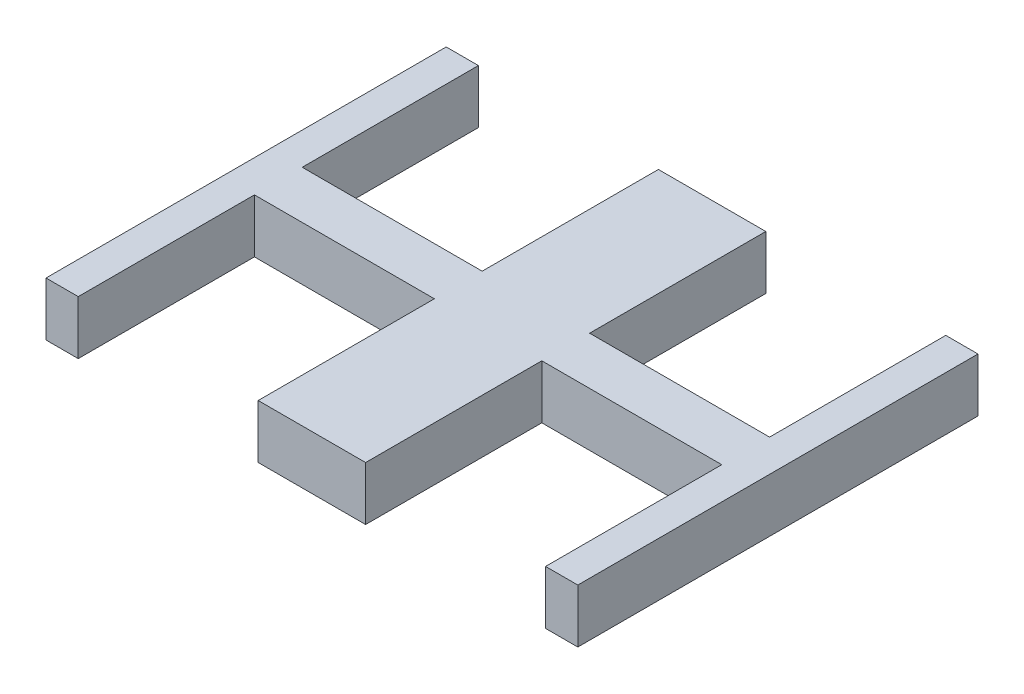
ISO-10303-21;
HEADER;
FILE_DESCRIPTION(('STEP AP214'),'2;1');
FILE_NAME('part.step','',(''),(''),'','','');
FILE_SCHEMA(('AUTOMOTIVE_DESIGN { 1 0 10303 214 1 1 1 1 }'));
ENDSEC;
DATA;
#1=APPLICATION_CONTEXT('core data for automotive mechanical design processes');
#2=APPLICATION_PROTOCOL_DEFINITION('international standard','automotive_design',2000,#1);
#3=PRODUCT_CONTEXT('',#1,'mechanical');
#4=PRODUCT('Part','Part','',(#3));
#5=PRODUCT_RELATED_PRODUCT_CATEGORY('part','',(#4));
#6=PRODUCT_DEFINITION_FORMATION('','',#4);
#7=PRODUCT_DEFINITION_CONTEXT('part definition',#1,'design');
#8=PRODUCT_DEFINITION('design','',#6,#7);
#9=PRODUCT_DEFINITION_SHAPE('','',#8);
#10=(LENGTH_UNIT() NAMED_UNIT(*) SI_UNIT(.MILLI.,.METRE.));
#11=(NAMED_UNIT(*) PLANE_ANGLE_UNIT() SI_UNIT($,.RADIAN.));
#12=(NAMED_UNIT(*) SI_UNIT($,.STERADIAN.) SOLID_ANGLE_UNIT());
#13=UNCERTAINTY_MEASURE_WITH_UNIT(LENGTH_MEASURE(1.E-05),#10,'distance_accuracy_value','');
#14=(GEOMETRIC_REPRESENTATION_CONTEXT(3) GLOBAL_UNCERTAINTY_ASSIGNED_CONTEXT((#13)) GLOBAL_UNIT_ASSIGNED_CONTEXT((#10,
#11,#12)) REPRESENTATION_CONTEXT('',''));
#15=CARTESIAN_POINT('',(0.,0.,0.));
#16=DIRECTION('',(0.,0.,1.));
#17=DIRECTION('',(1.,0.,0.));
#18=AXIS2_PLACEMENT_3D('',#15,#16,#17);
#19=CARTESIAN_POINT('',(-9.9,2.,-7.45));
#20=DIRECTION('',(0.,0.,1.));
#21=DIRECTION('',(1.,0.,0.));
#22=AXIS2_PLACEMENT_3D('',#19,#20,#21);
#23=PLANE('',#22);
#24=DIRECTION('',(-1.,0.,0.));
#25=VECTOR('',#24,1.);
#26=CARTESIAN_POINT('',(-9.9,0.,-7.45));
#27=LINE('',#26,#25);
#28=CARTESIAN_POINT('',(9.9,0.,-7.45));
#29=VERTEX_POINT('',#28);
#30=CARTESIAN_POINT('',(8.7,0.,-7.45));
#31=VERTEX_POINT('',#30);
#32=EDGE_CURVE('E261',#29,#31,#27,.T.);
#33=ORIENTED_EDGE('',*,*,#32,.T.);
#34=DIRECTION('',(0.,1.,0.));
#35=VECTOR('',#34,1.);
#36=CARTESIAN_POINT('',(8.7,0.,-7.45));
#37=LINE('',#36,#35);
#38=CARTESIAN_POINT('',(8.7,2.,-7.45));
#39=VERTEX_POINT('',#38);
#40=EDGE_CURVE('E527',#31,#39,#37,.T.);
#41=ORIENTED_EDGE('',*,*,#40,.T.);
#42=DIRECTION('',(-1.,0.,0.));
#43=VECTOR('',#42,1.);
#44=CARTESIAN_POINT('',(-9.9,2.,-7.45));
#45=LINE('',#44,#43);
#46=CARTESIAN_POINT('',(9.9,2.,-7.45));
#47=VERTEX_POINT('',#46);
#48=EDGE_CURVE('E221',#47,#39,#45,.T.);
#49=ORIENTED_EDGE('',*,*,#48,.F.);
#50=DIRECTION('',(0.,-1.,0.));
#51=VECTOR('',#50,1.);
#52=CARTESIAN_POINT('',(9.9,2.,-7.45));
#53=LINE('',#52,#51);
#54=EDGE_CURVE('E11',#47,#29,#53,.T.);
#55=ORIENTED_EDGE('',*,*,#54,.T.);
#56=EDGE_LOOP('',(#33,#41,#49,#55));
#57=FACE_BOUND('',#56,.T.);
#58=ADVANCED_FACE('F45',(#57),#23,.F.);
#59=CARTESIAN_POINT('',(-8.7,2.,-7.45));
#60=VERTEX_POINT('',#59);
#61=CARTESIAN_POINT('',(-9.9,2.,-7.45));
#62=VERTEX_POINT('',#61);
#63=EDGE_CURVE('E297',#60,#62,#45,.T.);
#64=ORIENTED_EDGE('',*,*,#63,.F.);
#65=DIRECTION('',(0.,1.,0.));
#66=VECTOR('',#65,1.);
#67=CARTESIAN_POINT('',(-8.7,0.,-7.45));
#68=LINE('',#67,#66);
#69=CARTESIAN_POINT('',(-8.7,0.,-7.45));
#70=VERTEX_POINT('',#69);
#71=EDGE_CURVE('E270',#70,#60,#68,.T.);
#72=ORIENTED_EDGE('',*,*,#71,.F.);
#73=CARTESIAN_POINT('',(-9.9,0.,-7.45));
#74=VERTEX_POINT('',#73);
#75=EDGE_CURVE('E256',#70,#74,#27,.T.);
#76=ORIENTED_EDGE('',*,*,#75,.T.);
#77=DIRECTION('',(0.,-1.,0.));
#78=VECTOR('',#77,1.);
#79=CARTESIAN_POINT('',(-9.9,2.,-7.45));
#80=LINE('',#79,#78);
#81=EDGE_CURVE('E54',#62,#74,#80,.T.);
#82=ORIENTED_EDGE('',*,*,#81,.F.);
#83=EDGE_LOOP('',(#64,#72,#76,#82));
#84=FACE_BOUND('',#83,.T.);
#85=ADVANCED_FACE('F305',(#84),#23,.F.);
#86=CARTESIAN_POINT('',(-9.9,2.,7.45));
#87=DIRECTION('',(0.,0.,-1.));
#88=DIRECTION('',(-1.,0.,0.));
#89=AXIS2_PLACEMENT_3D('',#86,#87,#88);
#90=PLANE('',#89);
#91=DIRECTION('',(1.,0.,0.));
#92=VECTOR('',#91,1.);
#93=CARTESIAN_POINT('',(-9.9,0.,7.45));
#94=LINE('',#93,#92);
#95=CARTESIAN_POINT('',(-9.9,0.,7.45));
#96=VERTEX_POINT('',#95);
#97=CARTESIAN_POINT('',(-8.7,0.,7.45));
#98=VERTEX_POINT('',#97);
#99=EDGE_CURVE('E238',#96,#98,#94,.T.);
#100=ORIENTED_EDGE('',*,*,#99,.T.);
#101=DIRECTION('',(0.,1.,0.));
#102=VECTOR('',#101,1.);
#103=CARTESIAN_POINT('',(-8.7,0.,7.45));
#104=LINE('',#103,#102);
#105=CARTESIAN_POINT('',(-8.7,2.,7.45));
#106=VERTEX_POINT('',#105);
#107=EDGE_CURVE('E340',#98,#106,#104,.T.);
#108=ORIENTED_EDGE('',*,*,#107,.T.);
#109=DIRECTION('',(1.,0.,0.));
#110=VECTOR('',#109,1.);
#111=CARTESIAN_POINT('',(-9.9,2.,7.45));
#112=LINE('',#111,#110);
#113=CARTESIAN_POINT('',(-9.9,2.,7.45));
#114=VERTEX_POINT('',#113);
#115=EDGE_CURVE('E217',#114,#106,#112,.T.);
#116=ORIENTED_EDGE('',*,*,#115,.F.);
#117=DIRECTION('',(0.,-1.,0.));
#118=VECTOR('',#117,1.);
#119=CARTESIAN_POINT('',(-9.9,2.,7.45));
#120=LINE('',#119,#118);
#121=EDGE_CURVE('E229',#114,#96,#120,.T.);
#122=ORIENTED_EDGE('',*,*,#121,.T.);
#123=EDGE_LOOP('',(#100,#108,#116,#122));
#124=FACE_BOUND('',#123,.T.);
#125=ADVANCED_FACE('F307',(#124),#90,.F.);
#126=CARTESIAN_POINT('',(8.7,2.,7.45));
#127=VERTEX_POINT('',#126);
#128=CARTESIAN_POINT('',(9.9,2.,7.45));
#129=VERTEX_POINT('',#128);
#130=EDGE_CURVE('E201',#127,#129,#112,.T.);
#131=ORIENTED_EDGE('',*,*,#130,.F.);
#132=DIRECTION('',(0.,1.,0.));
#133=VECTOR('',#132,1.);
#134=CARTESIAN_POINT('',(8.7,0.,7.45));
#135=LINE('',#134,#133);
#136=CARTESIAN_POINT('',(8.7,0.,7.45));
#137=VERTEX_POINT('',#136);
#138=EDGE_CURVE('E183',#137,#127,#135,.T.);
#139=ORIENTED_EDGE('',*,*,#138,.F.);
#140=CARTESIAN_POINT('',(9.9,0.,7.45));
#141=VERTEX_POINT('',#140);
#142=EDGE_CURVE('E260',#137,#141,#94,.T.);
#143=ORIENTED_EDGE('',*,*,#142,.T.);
#144=DIRECTION('',(0.,-1.,0.));
#145=VECTOR('',#144,1.);
#146=CARTESIAN_POINT('',(9.9,2.,7.45));
#147=LINE('',#146,#145);
#148=EDGE_CURVE('E211',#129,#141,#147,.T.);
#149=ORIENTED_EDGE('',*,*,#148,.F.);
#150=EDGE_LOOP('',(#131,#139,#143,#149));
#151=FACE_BOUND('',#150,.T.);
#152=ADVANCED_FACE('F209',(#151),#90,.F.);
#153=CARTESIAN_POINT('',(9.9,2.,-7.45));
#154=DIRECTION('',(-1.,0.,0.));
#155=DIRECTION('',(0.,0.,1.));
#156=AXIS2_PLACEMENT_3D('',#153,#154,#155);
#157=PLANE('',#156);
#158=DIRECTION('',(0.,0.,-1.));
#159=VECTOR('',#158,1.);
#160=CARTESIAN_POINT('',(9.9,0.,-7.45));
#161=LINE('',#160,#159);
#162=EDGE_CURVE('E268',#141,#29,#161,.T.);
#163=ORIENTED_EDGE('',*,*,#162,.T.);
#164=ORIENTED_EDGE('',*,*,#54,.F.);
#165=DIRECTION('',(0.,0.,-1.));
#166=VECTOR('',#165,1.);
#167=CARTESIAN_POINT('',(9.9,2.,-7.45));
#168=LINE('',#167,#166);
#169=EDGE_CURVE('E294',#129,#47,#168,.T.);
#170=ORIENTED_EDGE('',*,*,#169,.F.);
#171=ORIENTED_EDGE('',*,*,#148,.T.);
#172=EDGE_LOOP('',(#163,#164,#170,#171));
#173=FACE_BOUND('',#172,.T.);
#174=ADVANCED_FACE('F47',(#173),#157,.F.);
#175=CARTESIAN_POINT('',(2.,2.,-7.45));
#176=VERTEX_POINT('',#175);
#177=CARTESIAN_POINT('',(-2.,2.,-7.45));
#178=VERTEX_POINT('',#177);
#179=EDGE_CURVE('E300',#176,#178,#45,.T.);
#180=ORIENTED_EDGE('',*,*,#179,.F.);
#181=DIRECTION('',(0.,1.,0.));
#182=VECTOR('',#181,1.);
#183=CARTESIAN_POINT('',(2.,0.,-7.45));
#184=LINE('',#183,#182);
#185=CARTESIAN_POINT('',(2.,0.,-7.45));
#186=VERTEX_POINT('',#185);
#187=EDGE_CURVE('E329',#186,#176,#184,.T.);
#188=ORIENTED_EDGE('',*,*,#187,.F.);
#189=CARTESIAN_POINT('',(-2.,0.,-7.45));
#190=VERTEX_POINT('',#189);
#191=EDGE_CURVE('E266',#186,#190,#27,.T.);
#192=ORIENTED_EDGE('',*,*,#191,.T.);
#193=DIRECTION('',(0.,1.,0.));
#194=VECTOR('',#193,1.);
#195=CARTESIAN_POINT('',(-2.,0.,-7.45));
#196=LINE('',#195,#194);
#197=EDGE_CURVE('E274',#190,#178,#196,.T.);
#198=ORIENTED_EDGE('',*,*,#197,.T.);
#199=EDGE_LOOP('',(#180,#188,#192,#198));
#200=FACE_BOUND('',#199,.T.);
#201=ADVANCED_FACE('F308',(#200),#23,.F.);
#202=CARTESIAN_POINT('',(-9.9,2.,-7.45));
#203=DIRECTION('',(1.,0.,0.));
#204=DIRECTION('',(0.,0.,-1.));
#205=AXIS2_PLACEMENT_3D('',#202,#203,#204);
#206=PLANE('',#205);
#207=DIRECTION('',(0.,0.,1.));
#208=VECTOR('',#207,1.);
#209=CARTESIAN_POINT('',(-9.9,0.,-7.45));
#210=LINE('',#209,#208);
#211=EDGE_CURVE('E248',#74,#96,#210,.T.);
#212=ORIENTED_EDGE('',*,*,#211,.T.);
#213=ORIENTED_EDGE('',*,*,#121,.F.);
#214=DIRECTION('',(0.,0.,1.));
#215=VECTOR('',#214,1.);
#216=CARTESIAN_POINT('',(-9.9,2.,-7.45));
#217=LINE('',#216,#215);
#218=EDGE_CURVE('E215',#62,#114,#217,.T.);
#219=ORIENTED_EDGE('',*,*,#218,.F.);
#220=ORIENTED_EDGE('',*,*,#81,.T.);
#221=EDGE_LOOP('',(#212,#213,#219,#220));
#222=FACE_BOUND('',#221,.T.);
#223=ADVANCED_FACE('F246',(#222),#206,.F.);
#224=CARTESIAN_POINT('',(-2.,2.,7.45));
#225=VERTEX_POINT('',#224);
#226=CARTESIAN_POINT('',(2.,2.,7.45));
#227=VERTEX_POINT('',#226);
#228=EDGE_CURVE('E214',#225,#227,#112,.T.);
#229=ORIENTED_EDGE('',*,*,#228,.F.);
#230=DIRECTION('',(0.,1.,0.));
#231=VECTOR('',#230,1.);
#232=CARTESIAN_POINT('',(-2.,0.,7.45));
#233=LINE('',#232,#231);
#234=CARTESIAN_POINT('',(-2.,0.,7.45));
#235=VERTEX_POINT('',#234);
#236=EDGE_CURVE('E546',#235,#225,#233,.T.);
#237=ORIENTED_EDGE('',*,*,#236,.F.);
#238=CARTESIAN_POINT('',(2.,0.,7.45));
#239=VERTEX_POINT('',#238);
#240=EDGE_CURVE('E264',#235,#239,#94,.T.);
#241=ORIENTED_EDGE('',*,*,#240,.T.);
#242=DIRECTION('',(0.,1.,0.));
#243=VECTOR('',#242,1.);
#244=CARTESIAN_POINT('',(2.,0.,7.45));
#245=LINE('',#244,#243);
#246=EDGE_CURVE('E194',#239,#227,#245,.T.);
#247=ORIENTED_EDGE('',*,*,#246,.T.);
#248=EDGE_LOOP('',(#229,#237,#241,#247));
#249=FACE_BOUND('',#248,.T.);
#250=ADVANCED_FACE('F315',(#249),#90,.F.);
#251=CARTESIAN_POINT('',(0.,2.,0.));
#252=DIRECTION('',(0.,1.,0.));
#253=DIRECTION('',(0.,0.,1.));
#254=AXIS2_PLACEMENT_3D('',#251,#252,#253);
#255=PLANE('',#254);
#256=DIRECTION('',(0.,0.,-1.));
#257=VECTOR('',#256,1.);
#258=CARTESIAN_POINT('',(8.7,2.,-7.45));
#259=LINE('',#258,#257);
#260=CARTESIAN_POINT('',(8.7,2.,-0.889999999999999));
#261=VERTEX_POINT('',#260);
#262=EDGE_CURVE('E347',#261,#39,#259,.T.);
#263=ORIENTED_EDGE('',*,*,#262,.F.);
#264=DIRECTION('',(1.,0.,0.));
#265=VECTOR('',#264,1.);
#266=CARTESIAN_POINT('',(8.7,2.,-0.889999999999999));
#267=LINE('',#266,#265);
#268=CARTESIAN_POINT('',(2.,2.,-0.889999999999999));
#269=VERTEX_POINT('',#268);
#270=EDGE_CURVE('E337',#269,#261,#267,.T.);
#271=ORIENTED_EDGE('',*,*,#270,.F.);
#272=DIRECTION('',(0.,0.,1.));
#273=VECTOR('',#272,1.);
#274=CARTESIAN_POINT('',(2.,2.,-7.45));
#275=LINE('',#274,#273);
#276=EDGE_CURVE('E335',#176,#269,#275,.T.);
#277=ORIENTED_EDGE('',*,*,#276,.F.);
#278=ORIENTED_EDGE('',*,*,#179,.T.);
#279=DIRECTION('',(0.,0.,-1.));
#280=VECTOR('',#279,1.);
#281=CARTESIAN_POINT('',(-2.,2.,-7.45));
#282=LINE('',#281,#280);
#283=CARTESIAN_POINT('',(-2.,2.,-0.889999999999999));
#284=VERTEX_POINT('',#283);
#285=EDGE_CURVE('E285',#284,#178,#282,.T.);
#286=ORIENTED_EDGE('',*,*,#285,.F.);
#287=DIRECTION('',(1.,0.,0.));
#288=VECTOR('',#287,1.);
#289=CARTESIAN_POINT('',(-8.7,2.,-0.889999999999998));
#290=LINE('',#289,#288);
#291=CARTESIAN_POINT('',(-8.7,2.,-0.889999999999998));
#292=VERTEX_POINT('',#291);
#293=EDGE_CURVE('E372',#292,#284,#290,.T.);
#294=ORIENTED_EDGE('',*,*,#293,.F.);
#295=DIRECTION('',(0.,0.,1.));
#296=VECTOR('',#295,1.);
#297=CARTESIAN_POINT('',(-8.7,2.,-7.45));
#298=LINE('',#297,#296);
#299=EDGE_CURVE('E207',#60,#292,#298,.T.);
#300=ORIENTED_EDGE('',*,*,#299,.F.);
#301=ORIENTED_EDGE('',*,*,#63,.T.);
#302=ORIENTED_EDGE('',*,*,#218,.T.);
#303=ORIENTED_EDGE('',*,*,#115,.T.);
#304=DIRECTION('',(0.,0.,1.));
#305=VECTOR('',#304,1.);
#306=CARTESIAN_POINT('',(-8.7,2.,7.45));
#307=LINE('',#306,#305);
#308=CARTESIAN_POINT('',(-8.7,2.,0.890000000000002));
#309=VERTEX_POINT('',#308);
#310=EDGE_CURVE('E540',#309,#106,#307,.T.);
#311=ORIENTED_EDGE('',*,*,#310,.F.);
#312=DIRECTION('',(-1.,0.,0.));
#313=VECTOR('',#312,1.);
#314=CARTESIAN_POINT('',(-8.7,2.,0.890000000000002));
#315=LINE('',#314,#313);
#316=CARTESIAN_POINT('',(-2.,2.,0.890000000000002));
#317=VERTEX_POINT('',#316);
#318=EDGE_CURVE('E550',#317,#309,#315,.T.);
#319=ORIENTED_EDGE('',*,*,#318,.F.);
#320=DIRECTION('',(0.,0.,-1.));
#321=VECTOR('',#320,1.);
#322=CARTESIAN_POINT('',(-2.,2.,7.45));
#323=LINE('',#322,#321);
#324=EDGE_CURVE('E195',#225,#317,#323,.T.);
#325=ORIENTED_EDGE('',*,*,#324,.F.);
#326=ORIENTED_EDGE('',*,*,#228,.T.);
#327=DIRECTION('',(0.,0.,1.));
#328=VECTOR('',#327,1.);
#329=CARTESIAN_POINT('',(2.,2.,7.45));
#330=LINE('',#329,#328);
#331=CARTESIAN_POINT('',(2.,2.,0.890000000000004));
#332=VERTEX_POINT('',#331);
#333=EDGE_CURVE('E565',#332,#227,#330,.T.);
#334=ORIENTED_EDGE('',*,*,#333,.F.);
#335=DIRECTION('',(-1.,0.,0.));
#336=VECTOR('',#335,1.);
#337=CARTESIAN_POINT('',(8.7,2.,0.890000000000002));
#338=LINE('',#337,#336);
#339=CARTESIAN_POINT('',(8.7,2.,0.890000000000002));
#340=VERTEX_POINT('',#339);
#341=EDGE_CURVE('E205',#340,#332,#338,.T.);
#342=ORIENTED_EDGE('',*,*,#341,.F.);
#343=DIRECTION('',(0.,0.,-1.));
#344=VECTOR('',#343,1.);
#345=CARTESIAN_POINT('',(8.7,2.,7.45));
#346=LINE('',#345,#344);
#347=EDGE_CURVE('E186',#127,#340,#346,.T.);
#348=ORIENTED_EDGE('',*,*,#347,.F.);
#349=ORIENTED_EDGE('',*,*,#130,.T.);
#350=ORIENTED_EDGE('',*,*,#169,.T.);
#351=ORIENTED_EDGE('',*,*,#48,.T.);
#352=EDGE_LOOP('',(#263,#271,#277,#278,#286,#294,#300,#301,#302,#303,#311,#319,#325,#326,#334,
#342,#348,#349,#350,#351));
#353=FACE_BOUND('',#352,.T.);
#354=ADVANCED_FACE('F199',(#353),#255,.T.);
#355=CARTESIAN_POINT('',(0.,0.,0.));
#356=DIRECTION('',(0.,1.,0.));
#357=DIRECTION('',(0.,0.,1.));
#358=AXIS2_PLACEMENT_3D('',#355,#356,#357);
#359=PLANE('',#358);
#360=DIRECTION('',(1.,0.,0.));
#361=VECTOR('',#360,1.);
#362=CARTESIAN_POINT('',(8.7,0.,-0.889999999999999));
#363=LINE('',#362,#361);
#364=CARTESIAN_POINT('',(2.,0.,-0.889999999999999));
#365=VERTEX_POINT('',#364);
#366=CARTESIAN_POINT('',(8.7,0.,-0.889999999999999));
#367=VERTEX_POINT('',#366);
#368=EDGE_CURVE('E61',#365,#367,#363,.T.);
#369=ORIENTED_EDGE('',*,*,#368,.T.);
#370=DIRECTION('',(0.,0.,-1.));
#371=VECTOR('',#370,1.);
#372=CARTESIAN_POINT('',(8.7,0.,-7.45));
#373=LINE('',#372,#371);
#374=EDGE_CURVE('E351',#367,#31,#373,.T.);
#375=ORIENTED_EDGE('',*,*,#374,.T.);
#376=ORIENTED_EDGE('',*,*,#32,.F.);
#377=ORIENTED_EDGE('',*,*,#162,.F.);
#378=ORIENTED_EDGE('',*,*,#142,.F.);
#379=DIRECTION('',(0.,0.,-1.));
#380=VECTOR('',#379,1.);
#381=CARTESIAN_POINT('',(8.7,0.,7.45));
#382=LINE('',#381,#380);
#383=CARTESIAN_POINT('',(8.7,0.,0.890000000000002));
#384=VERTEX_POINT('',#383);
#385=EDGE_CURVE('E189',#137,#384,#382,.T.);
#386=ORIENTED_EDGE('',*,*,#385,.T.);
#387=DIRECTION('',(-1.,0.,0.));
#388=VECTOR('',#387,1.);
#389=CARTESIAN_POINT('',(8.7,0.,0.890000000000002));
#390=LINE('',#389,#388);
#391=CARTESIAN_POINT('',(2.,0.,0.890000000000004));
#392=VERTEX_POINT('',#391);
#393=EDGE_CURVE('E566',#384,#392,#390,.T.);
#394=ORIENTED_EDGE('',*,*,#393,.T.);
#395=DIRECTION('',(0.,0.,1.));
#396=VECTOR('',#395,1.);
#397=CARTESIAN_POINT('',(2.,0.,7.45));
#398=LINE('',#397,#396);
#399=EDGE_CURVE('E570',#392,#239,#398,.T.);
#400=ORIENTED_EDGE('',*,*,#399,.T.);
#401=ORIENTED_EDGE('',*,*,#240,.F.);
#402=DIRECTION('',(0.,0.,-1.));
#403=VECTOR('',#402,1.);
#404=CARTESIAN_POINT('',(-2.,0.,7.45));
#405=LINE('',#404,#403);
#406=CARTESIAN_POINT('',(-2.,0.,0.890000000000002));
#407=VERTEX_POINT('',#406);
#408=EDGE_CURVE('E536',#235,#407,#405,.T.);
#409=ORIENTED_EDGE('',*,*,#408,.T.);
#410=DIRECTION('',(-1.,0.,0.));
#411=VECTOR('',#410,1.);
#412=CARTESIAN_POINT('',(-8.7,0.,0.890000000000002));
#413=LINE('',#412,#411);
#414=CARTESIAN_POINT('',(-8.7,0.,0.890000000000002));
#415=VERTEX_POINT('',#414);
#416=EDGE_CURVE('E69',#407,#415,#413,.T.);
#417=ORIENTED_EDGE('',*,*,#416,.T.);
#418=DIRECTION('',(0.,0.,1.));
#419=VECTOR('',#418,1.);
#420=CARTESIAN_POINT('',(-8.7,0.,7.45));
#421=LINE('',#420,#419);
#422=EDGE_CURVE('E543',#415,#98,#421,.T.);
#423=ORIENTED_EDGE('',*,*,#422,.T.);
#424=ORIENTED_EDGE('',*,*,#99,.F.);
#425=ORIENTED_EDGE('',*,*,#211,.F.);
#426=ORIENTED_EDGE('',*,*,#75,.F.);
#427=DIRECTION('',(0.,0.,1.));
#428=VECTOR('',#427,1.);
#429=CARTESIAN_POINT('',(-8.7,0.,-7.45));
#430=LINE('',#429,#428);
#431=CARTESIAN_POINT('',(-8.7,0.,-0.889999999999998));
#432=VERTEX_POINT('',#431);
#433=EDGE_CURVE('E361',#70,#432,#430,.T.);
#434=ORIENTED_EDGE('',*,*,#433,.T.);
#435=DIRECTION('',(1.,0.,0.));
#436=VECTOR('',#435,1.);
#437=CARTESIAN_POINT('',(-8.7,0.,-0.889999999999998));
#438=LINE('',#437,#436);
#439=CARTESIAN_POINT('',(-2.,0.,-0.889999999999999));
#440=VERTEX_POINT('',#439);
#441=EDGE_CURVE('E364',#432,#440,#438,.T.);
#442=ORIENTED_EDGE('',*,*,#441,.T.);
#443=DIRECTION('',(0.,0.,-1.));
#444=VECTOR('',#443,1.);
#445=CARTESIAN_POINT('',(-2.,0.,-7.45));
#446=LINE('',#445,#444);
#447=EDGE_CURVE('E293',#440,#190,#446,.T.);
#448=ORIENTED_EDGE('',*,*,#447,.T.);
#449=ORIENTED_EDGE('',*,*,#191,.F.);
#450=DIRECTION('',(0.,0.,1.));
#451=VECTOR('',#450,1.);
#452=CARTESIAN_POINT('',(2.,0.,-7.45));
#453=LINE('',#452,#451);
#454=EDGE_CURVE('E357',#186,#365,#453,.T.);
#455=ORIENTED_EDGE('',*,*,#454,.T.);
#456=EDGE_LOOP('',(#369,#375,#376,#377,#378,#386,#394,#400,#401,#409,#417,#423,#424,#425,#426,
#434,#442,#448,#449,#455));
#457=FACE_BOUND('',#456,.T.);
#458=ADVANCED_FACE('F254',(#457),#359,.F.);
#459=CARTESIAN_POINT('',(-8.7,0.,-7.45));
#460=DIRECTION('',(-1.,0.,0.));
#461=DIRECTION('',(0.,0.,1.));
#462=AXIS2_PLACEMENT_3D('',#459,#460,#461);
#463=PLANE('',#462);
#464=ORIENTED_EDGE('',*,*,#299,.T.);
#465=DIRECTION('',(0.,1.,0.));
#466=VECTOR('',#465,1.);
#467=CARTESIAN_POINT('',(-8.7,0.,-0.889999999999998));
#468=LINE('',#467,#466);
#469=EDGE_CURVE('E290',#432,#292,#468,.T.);
#470=ORIENTED_EDGE('',*,*,#469,.F.);
#471=ORIENTED_EDGE('',*,*,#433,.F.);
#472=ORIENTED_EDGE('',*,*,#71,.T.);
#473=EDGE_LOOP('',(#464,#470,#471,#472));
#474=FACE_BOUND('',#473,.T.);
#475=ADVANCED_FACE('F382',(#474),#463,.F.);
#476=CARTESIAN_POINT('',(-2.,0.,-7.45));
#477=DIRECTION('',(1.,0.,0.));
#478=DIRECTION('',(0.,0.,-1.));
#479=AXIS2_PLACEMENT_3D('',#476,#477,#478);
#480=PLANE('',#479);
#481=ORIENTED_EDGE('',*,*,#285,.T.);
#482=ORIENTED_EDGE('',*,*,#197,.F.);
#483=ORIENTED_EDGE('',*,*,#447,.F.);
#484=DIRECTION('',(0.,1.,0.));
#485=VECTOR('',#484,1.);
#486=CARTESIAN_POINT('',(-2.,0.,-0.889999999999999));
#487=LINE('',#486,#485);
#488=EDGE_CURVE('E282',#440,#284,#487,.T.);
#489=ORIENTED_EDGE('',*,*,#488,.T.);
#490=EDGE_LOOP('',(#481,#482,#483,#489));
#491=FACE_BOUND('',#490,.T.);
#492=ADVANCED_FACE('F379',(#491),#480,.F.);
#493=CARTESIAN_POINT('',(-8.7,0.,-0.889999999999998));
#494=DIRECTION('',(0.,0.,1.));
#495=DIRECTION('',(1.,0.,0.));
#496=AXIS2_PLACEMENT_3D('',#493,#494,#495);
#497=PLANE('',#496);
#498=ORIENTED_EDGE('',*,*,#293,.T.);
#499=ORIENTED_EDGE('',*,*,#488,.F.);
#500=ORIENTED_EDGE('',*,*,#441,.F.);
#501=ORIENTED_EDGE('',*,*,#469,.T.);
#502=EDGE_LOOP('',(#498,#499,#500,#501));
#503=FACE_BOUND('',#502,.T.);
#504=ADVANCED_FACE('F381',(#503),#497,.F.);
#505=CARTESIAN_POINT('',(8.7,0.,7.45));
#506=DIRECTION('',(1.,0.,0.));
#507=DIRECTION('',(0.,0.,-1.));
#508=AXIS2_PLACEMENT_3D('',#505,#506,#507);
#509=PLANE('',#508);
#510=ORIENTED_EDGE('',*,*,#347,.T.);
#511=DIRECTION('',(0.,1.,0.));
#512=VECTOR('',#511,1.);
#513=CARTESIAN_POINT('',(8.7,0.,0.890000000000002));
#514=LINE('',#513,#512);
#515=EDGE_CURVE('E573',#384,#340,#514,.T.);
#516=ORIENTED_EDGE('',*,*,#515,.F.);
#517=ORIENTED_EDGE('',*,*,#385,.F.);
#518=ORIENTED_EDGE('',*,*,#138,.T.);
#519=EDGE_LOOP('',(#510,#516,#517,#518));
#520=FACE_BOUND('',#519,.T.);
#521=ADVANCED_FACE('F185',(#520),#509,.F.);
#522=CARTESIAN_POINT('',(2.,0.,7.45));
#523=DIRECTION('',(-1.,0.,0.));
#524=DIRECTION('',(0.,0.,1.));
#525=AXIS2_PLACEMENT_3D('',#522,#523,#524);
#526=PLANE('',#525);
#527=ORIENTED_EDGE('',*,*,#333,.T.);
#528=ORIENTED_EDGE('',*,*,#246,.F.);
#529=ORIENTED_EDGE('',*,*,#399,.F.);
#530=DIRECTION('',(0.,1.,0.));
#531=VECTOR('',#530,1.);
#532=CARTESIAN_POINT('',(2.,0.,0.890000000000004));
#533=LINE('',#532,#531);
#534=EDGE_CURVE('E582',#392,#332,#533,.T.);
#535=ORIENTED_EDGE('',*,*,#534,.T.);
#536=EDGE_LOOP('',(#527,#528,#529,#535));
#537=FACE_BOUND('',#536,.T.);
#538=ADVANCED_FACE('F439',(#537),#526,.F.);
#539=CARTESIAN_POINT('',(8.7,0.,0.890000000000002));
#540=DIRECTION('',(0.,0.,-1.));
#541=DIRECTION('',(-1.,0.,0.));
#542=AXIS2_PLACEMENT_3D('',#539,#540,#541);
#543=PLANE('',#542);
#544=ORIENTED_EDGE('',*,*,#341,.T.);
#545=ORIENTED_EDGE('',*,*,#534,.F.);
#546=ORIENTED_EDGE('',*,*,#393,.F.);
#547=ORIENTED_EDGE('',*,*,#515,.T.);
#548=EDGE_LOOP('',(#544,#545,#546,#547));
#549=FACE_BOUND('',#548,.T.);
#550=ADVANCED_FACE('F447',(#549),#543,.F.);
#551=CARTESIAN_POINT('',(-8.7,0.,7.45));
#552=DIRECTION('',(-1.,0.,0.));
#553=DIRECTION('',(0.,0.,1.));
#554=AXIS2_PLACEMENT_3D('',#551,#552,#553);
#555=PLANE('',#554);
#556=ORIENTED_EDGE('',*,*,#310,.T.);
#557=ORIENTED_EDGE('',*,*,#107,.F.);
#558=ORIENTED_EDGE('',*,*,#422,.F.);
#559=DIRECTION('',(0.,1.,0.));
#560=VECTOR('',#559,1.);
#561=CARTESIAN_POINT('',(-8.7,0.,0.890000000000002));
#562=LINE('',#561,#560);
#563=EDGE_CURVE('E345',#415,#309,#562,.T.);
#564=ORIENTED_EDGE('',*,*,#563,.T.);
#565=EDGE_LOOP('',(#556,#557,#558,#564));
#566=FACE_BOUND('',#565,.T.);
#567=ADVANCED_FACE('F456',(#566),#555,.F.);
#568=CARTESIAN_POINT('',(-8.7,0.,0.890000000000002));
#569=DIRECTION('',(0.,0.,-1.));
#570=DIRECTION('',(-1.,0.,0.));
#571=AXIS2_PLACEMENT_3D('',#568,#569,#570);
#572=PLANE('',#571);
#573=ORIENTED_EDGE('',*,*,#318,.T.);
#574=ORIENTED_EDGE('',*,*,#563,.F.);
#575=ORIENTED_EDGE('',*,*,#416,.F.);
#576=DIRECTION('',(0.,1.,0.));
#577=VECTOR('',#576,1.);
#578=CARTESIAN_POINT('',(-2.,0.,0.890000000000002));
#579=LINE('',#578,#577);
#580=EDGE_CURVE('E558',#407,#317,#579,.T.);
#581=ORIENTED_EDGE('',*,*,#580,.T.);
#582=EDGE_LOOP('',(#573,#574,#575,#581));
#583=FACE_BOUND('',#582,.T.);
#584=ADVANCED_FACE('F465',(#583),#572,.F.);
#585=CARTESIAN_POINT('',(-2.,0.,7.45));
#586=DIRECTION('',(1.,0.,0.));
#587=DIRECTION('',(0.,0.,-1.));
#588=AXIS2_PLACEMENT_3D('',#585,#586,#587);
#589=PLANE('',#588);
#590=ORIENTED_EDGE('',*,*,#324,.T.);
#591=ORIENTED_EDGE('',*,*,#580,.F.);
#592=ORIENTED_EDGE('',*,*,#408,.F.);
#593=ORIENTED_EDGE('',*,*,#236,.T.);
#594=EDGE_LOOP('',(#590,#591,#592,#593));
#595=FACE_BOUND('',#594,.T.);
#596=ADVANCED_FACE('F474',(#595),#589,.F.);
#597=CARTESIAN_POINT('',(8.7,0.,-7.45));
#598=DIRECTION('',(1.,0.,0.));
#599=DIRECTION('',(0.,0.,-1.));
#600=AXIS2_PLACEMENT_3D('',#597,#598,#599);
#601=PLANE('',#600);
#602=ORIENTED_EDGE('',*,*,#262,.T.);
#603=ORIENTED_EDGE('',*,*,#40,.F.);
#604=ORIENTED_EDGE('',*,*,#374,.F.);
#605=DIRECTION('',(0.,1.,0.));
#606=VECTOR('',#605,1.);
#607=CARTESIAN_POINT('',(8.7,0.,-0.889999999999999));
#608=LINE('',#607,#606);
#609=EDGE_CURVE('E521',#367,#261,#608,.T.);
#610=ORIENTED_EDGE('',*,*,#609,.T.);
#611=EDGE_LOOP('',(#602,#603,#604,#610));
#612=FACE_BOUND('',#611,.T.);
#613=ADVANCED_FACE('F482',(#612),#601,.F.);
#614=CARTESIAN_POINT('',(8.7,0.,-0.889999999999999));
#615=DIRECTION('',(0.,0.,1.));
#616=DIRECTION('',(1.,0.,0.));
#617=AXIS2_PLACEMENT_3D('',#614,#615,#616);
#618=PLANE('',#617);
#619=ORIENTED_EDGE('',*,*,#270,.T.);
#620=ORIENTED_EDGE('',*,*,#609,.F.);
#621=ORIENTED_EDGE('',*,*,#368,.F.);
#622=DIRECTION('',(0.,1.,0.));
#623=VECTOR('',#622,1.);
#624=CARTESIAN_POINT('',(2.,0.,-0.889999999999999));
#625=LINE('',#624,#623);
#626=EDGE_CURVE('E523',#365,#269,#625,.T.);
#627=ORIENTED_EDGE('',*,*,#626,.T.);
#628=EDGE_LOOP('',(#619,#620,#621,#627));
#629=FACE_BOUND('',#628,.T.);
#630=ADVANCED_FACE('F491',(#629),#618,.F.);
#631=CARTESIAN_POINT('',(2.,0.,-7.45));
#632=DIRECTION('',(-1.,0.,0.));
#633=DIRECTION('',(0.,0.,1.));
#634=AXIS2_PLACEMENT_3D('',#631,#632,#633);
#635=PLANE('',#634);
#636=ORIENTED_EDGE('',*,*,#276,.T.);
#637=ORIENTED_EDGE('',*,*,#626,.F.);
#638=ORIENTED_EDGE('',*,*,#454,.F.);
#639=ORIENTED_EDGE('',*,*,#187,.T.);
#640=EDGE_LOOP('',(#636,#637,#638,#639));
#641=FACE_BOUND('',#640,.T.);
#642=ADVANCED_FACE('F500',(#641),#635,.F.);
#643=CLOSED_SHELL('',(#58,#85,#125,#152,#174,#201,#223,#250,#354,#458,#475,#492,#504,#521,#538,
#550,#567,#584,#596,#613,#630,#642));
#644=MANIFOLD_SOLID_BREP('B2',#643);
#645=ADVANCED_BREP_SHAPE_REPRESENTATION('',(#18,#644),#14);
#646=SHAPE_DEFINITION_REPRESENTATION(#9,#645);
ENDSEC;
END-ISO-10303-21;
